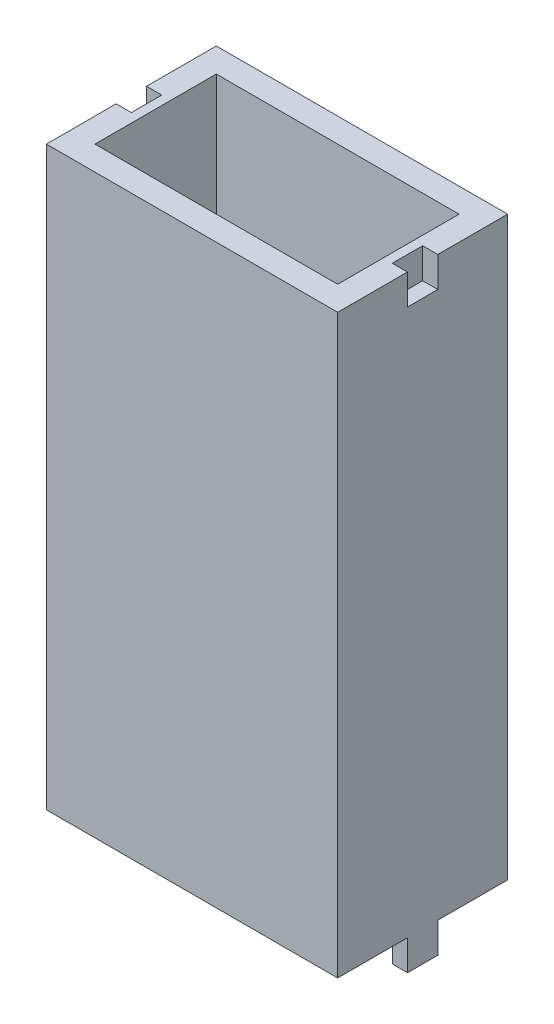
ISO-10303-21;
HEADER;
FILE_DESCRIPTION(('STEP AP214'),'2;1');
FILE_NAME('part.step','',(''),(''),'','','');
FILE_SCHEMA(('AUTOMOTIVE_DESIGN { 1 0 10303 214 1 1 1 1 }'));
ENDSEC;
DATA;
#1=APPLICATION_CONTEXT('core data for automotive mechanical design processes');
#2=APPLICATION_PROTOCOL_DEFINITION('international standard','automotive_design',2000,#1);
#3=PRODUCT_CONTEXT('',#1,'mechanical');
#4=PRODUCT('Part','Part','',(#3));
#5=PRODUCT_RELATED_PRODUCT_CATEGORY('part','',(#4));
#6=PRODUCT_DEFINITION_FORMATION('','',#4);
#7=PRODUCT_DEFINITION_CONTEXT('part definition',#1,'design');
#8=PRODUCT_DEFINITION('design','',#6,#7);
#9=PRODUCT_DEFINITION_SHAPE('','',#8);
#10=(LENGTH_UNIT() NAMED_UNIT(*) SI_UNIT(.MILLI.,.METRE.));
#11=(NAMED_UNIT(*) PLANE_ANGLE_UNIT() SI_UNIT($,.RADIAN.));
#12=(NAMED_UNIT(*) SI_UNIT($,.STERADIAN.) SOLID_ANGLE_UNIT());
#13=UNCERTAINTY_MEASURE_WITH_UNIT(LENGTH_MEASURE(1.E-05),#10,'distance_accuracy_value','');
#14=(GEOMETRIC_REPRESENTATION_CONTEXT(3) GLOBAL_UNCERTAINTY_ASSIGNED_CONTEXT((#13)) GLOBAL_UNIT_ASSIGNED_CONTEXT((#10,
#11,#12)) REPRESENTATION_CONTEXT('',''));
#15=CARTESIAN_POINT('',(0.,0.,0.));
#16=DIRECTION('',(0.,0.,1.));
#17=DIRECTION('',(1.,0.,0.));
#18=AXIS2_PLACEMENT_3D('',#15,#16,#17);
#19=CARTESIAN_POINT('',(0.,0.,0.));
#20=DIRECTION('',(0.,1.,0.));
#21=DIRECTION('',(0.,0.,1.));
#22=AXIS2_PLACEMENT_3D('',#19,#20,#21);
#23=PLANE('',#22);
#24=DIRECTION('',(0.,0.,1.));
#25=VECTOR('',#24,1.);
#26=CARTESIAN_POINT('',(0.,0.,0.));
#27=LINE('',#26,#25);
#28=CARTESIAN_POINT('',(0.,0.,0.));
#29=VERTEX_POINT('',#28);
#30=CARTESIAN_POINT('',(0.,0.,20.));
#31=VERTEX_POINT('',#30);
#32=EDGE_CURVE('E320',#29,#31,#27,.T.);
#33=ORIENTED_EDGE('',*,*,#32,.T.);
#34=DIRECTION('',(1.,0.,0.));
#35=VECTOR('',#34,1.);
#36=CARTESIAN_POINT('',(0.,0.,20.));
#37=LINE('',#36,#35);
#38=CARTESIAN_POINT('',(40.,0.,20.));
#39=VERTEX_POINT('',#38);
#40=EDGE_CURVE('E383',#31,#39,#37,.T.);
#41=ORIENTED_EDGE('',*,*,#40,.T.);
#42=DIRECTION('',(0.,0.,-1.));
#43=VECTOR('',#42,1.);
#44=CARTESIAN_POINT('',(40.,0.,0.));
#45=LINE('',#44,#43);
#46=CARTESIAN_POINT('',(40.,0.,0.));
#47=VERTEX_POINT('',#46);
#48=EDGE_CURVE('E387',#39,#47,#45,.T.);
#49=ORIENTED_EDGE('',*,*,#48,.T.);
#50=DIRECTION('',(-1.,0.,0.));
#51=VECTOR('',#50,1.);
#52=CARTESIAN_POINT('',(0.,0.,0.));
#53=LINE('',#52,#51);
#54=EDGE_CURVE('E369',#47,#29,#53,.T.);
#55=ORIENTED_EDGE('',*,*,#54,.T.);
#56=EDGE_LOOP('',(#33,#41,#49,#55));
#57=FACE_BOUND('',#56,.T.);
#58=DIRECTION('',(1.,0.,0.));
#59=VECTOR('',#58,1.);
#60=CARTESIAN_POINT('',(41.5,0.,7.50000000000001));
#61=LINE('',#60,#59);
#62=CARTESIAN_POINT('',(41.5,0.,7.50000000000001));
#63=VERTEX_POINT('',#62);
#64=CARTESIAN_POINT('',(44.,0.,7.5));
#65=VERTEX_POINT('',#64);
#66=EDGE_CURVE('E220',#63,#65,#61,.T.);
#67=ORIENTED_EDGE('',*,*,#66,.F.);
#68=DIRECTION('',(0.,0.,-1.));
#69=VECTOR('',#68,1.);
#70=CARTESIAN_POINT('',(41.5,0.,12.5));
#71=LINE('',#70,#69);
#72=CARTESIAN_POINT('',(41.5,0.,12.5));
#73=VERTEX_POINT('',#72);
#74=EDGE_CURVE('E227',#73,#63,#71,.T.);
#75=ORIENTED_EDGE('',*,*,#74,.F.);
#76=DIRECTION('',(-1.,0.,0.));
#77=VECTOR('',#76,1.);
#78=CARTESIAN_POINT('',(41.5,0.,12.5));
#79=LINE('',#78,#77);
#80=CARTESIAN_POINT('',(44.,0.,12.5));
#81=VERTEX_POINT('',#80);
#82=EDGE_CURVE('E208',#81,#73,#79,.T.);
#83=ORIENTED_EDGE('',*,*,#82,.F.);
#84=DIRECTION('',(0.,0.,-1.));
#85=VECTOR('',#84,1.);
#86=CARTESIAN_POINT('',(44.,0.,-4.));
#87=LINE('',#86,#85);
#88=CARTESIAN_POINT('',(44.,0.,24.));
#89=VERTEX_POINT('',#88);
#90=EDGE_CURVE('E433',#89,#81,#87,.T.);
#91=ORIENTED_EDGE('',*,*,#90,.F.);
#92=DIRECTION('',(1.,0.,0.));
#93=VECTOR('',#92,1.);
#94=CARTESIAN_POINT('',(-4.,0.,24.));
#95=LINE('',#94,#93);
#96=CARTESIAN_POINT('',(-4.,0.,24.));
#97=VERTEX_POINT('',#96);
#98=EDGE_CURVE('E429',#97,#89,#95,.T.);
#99=ORIENTED_EDGE('',*,*,#98,.F.);
#100=DIRECTION('',(0.,0.,1.));
#101=VECTOR('',#100,1.);
#102=CARTESIAN_POINT('',(-4.,0.,-4.));
#103=LINE('',#102,#101);
#104=CARTESIAN_POINT('',(-4.,0.,12.5));
#105=VERTEX_POINT('',#104);
#106=EDGE_CURVE('E407',#105,#97,#103,.T.);
#107=ORIENTED_EDGE('',*,*,#106,.F.);
#108=DIRECTION('',(-1.,0.,0.));
#109=VECTOR('',#108,1.);
#110=CARTESIAN_POINT('',(-4.,0.,12.5));
#111=LINE('',#110,#109);
#112=CARTESIAN_POINT('',(-1.5,0.,12.5));
#113=VERTEX_POINT('',#112);
#114=EDGE_CURVE('E69',#113,#105,#111,.T.);
#115=ORIENTED_EDGE('',*,*,#114,.F.);
#116=DIRECTION('',(0.,0.,1.));
#117=VECTOR('',#116,1.);
#118=CARTESIAN_POINT('',(-1.5,0.,12.5));
#119=LINE('',#118,#117);
#120=CARTESIAN_POINT('',(-1.5,0.,7.5));
#121=VERTEX_POINT('',#120);
#122=EDGE_CURVE('E240',#121,#113,#119,.T.);
#123=ORIENTED_EDGE('',*,*,#122,.F.);
#124=DIRECTION('',(1.,0.,0.));
#125=VECTOR('',#124,1.);
#126=CARTESIAN_POINT('',(-4.,0.,7.5));
#127=LINE('',#126,#125);
#128=CARTESIAN_POINT('',(-4.,0.,7.5));
#129=VERTEX_POINT('',#128);
#130=EDGE_CURVE('E235',#129,#121,#127,.T.);
#131=ORIENTED_EDGE('',*,*,#130,.F.);
#132=CARTESIAN_POINT('',(-4.,0.,-4.));
#133=VERTEX_POINT('',#132);
#134=EDGE_CURVE('E425',#133,#129,#103,.T.);
#135=ORIENTED_EDGE('',*,*,#134,.F.);
#136=DIRECTION('',(-1.,0.,0.));
#137=VECTOR('',#136,1.);
#138=CARTESIAN_POINT('',(-4.,0.,-4.));
#139=LINE('',#138,#137);
#140=CARTESIAN_POINT('',(44.,0.,-4.));
#141=VERTEX_POINT('',#140);
#142=EDGE_CURVE('E436',#141,#133,#139,.T.);
#143=ORIENTED_EDGE('',*,*,#142,.F.);
#144=EDGE_CURVE('E432',#65,#141,#87,.T.);
#145=ORIENTED_EDGE('',*,*,#144,.F.);
#146=EDGE_LOOP('',(#67,#75,#83,#91,#99,#107,#115,#123,#131,#135,#143,#145));
#147=FACE_BOUND('',#146,.T.);
#148=ADVANCED_FACE('F45',(#57,#147),#23,.F.);
#149=CARTESIAN_POINT('',(0.,95.,0.));
#150=DIRECTION('',(0.,1.,0.));
#151=DIRECTION('',(0.,0.,1.));
#152=AXIS2_PLACEMENT_3D('',#149,#150,#151);
#153=PLANE('',#152);
#154=DIRECTION('',(-1.,0.,0.));
#155=VECTOR('',#154,1.);
#156=CARTESIAN_POINT('',(-4.,95.,7.5));
#157=LINE('',#156,#155);
#158=CARTESIAN_POINT('',(-1.5,95.,7.5));
#159=VERTEX_POINT('',#158);
#160=CARTESIAN_POINT('',(-4.,95.,7.5));
#161=VERTEX_POINT('',#160);
#162=EDGE_CURVE('E293',#159,#161,#157,.T.);
#163=ORIENTED_EDGE('',*,*,#162,.F.);
#164=DIRECTION('',(0.,0.,-1.));
#165=VECTOR('',#164,1.);
#166=CARTESIAN_POINT('',(-1.5,95.,7.5));
#167=LINE('',#166,#165);
#168=CARTESIAN_POINT('',(-1.5,95.,12.5));
#169=VERTEX_POINT('',#168);
#170=EDGE_CURVE('E309',#169,#159,#167,.T.);
#171=ORIENTED_EDGE('',*,*,#170,.F.);
#172=DIRECTION('',(1.,0.,0.));
#173=VECTOR('',#172,1.);
#174=CARTESIAN_POINT('',(-4.,95.,12.5));
#175=LINE('',#174,#173);
#176=CARTESIAN_POINT('',(-4.,95.,12.5));
#177=VERTEX_POINT('',#176);
#178=EDGE_CURVE('E305',#177,#169,#175,.T.);
#179=ORIENTED_EDGE('',*,*,#178,.F.);
#180=DIRECTION('',(0.,0.,1.));
#181=VECTOR('',#180,1.);
#182=CARTESIAN_POINT('',(-4.,95.,-4.));
#183=LINE('',#182,#181);
#184=CARTESIAN_POINT('',(-4.,95.,24.));
#185=VERTEX_POINT('',#184);
#186=EDGE_CURVE('E413',#177,#185,#183,.T.);
#187=ORIENTED_EDGE('',*,*,#186,.T.);
#188=DIRECTION('',(1.,0.,0.));
#189=VECTOR('',#188,1.);
#190=CARTESIAN_POINT('',(-4.,95.,24.));
#191=LINE('',#190,#189);
#192=CARTESIAN_POINT('',(44.,95.,24.));
#193=VERTEX_POINT('',#192);
#194=EDGE_CURVE('E412',#185,#193,#191,.T.);
#195=ORIENTED_EDGE('',*,*,#194,.T.);
#196=DIRECTION('',(0.,0.,-1.));
#197=VECTOR('',#196,1.);
#198=CARTESIAN_POINT('',(44.,95.,-4.));
#199=LINE('',#198,#197);
#200=CARTESIAN_POINT('',(44.,95.,12.5));
#201=VERTEX_POINT('',#200);
#202=EDGE_CURVE('E417',#193,#201,#199,.T.);
#203=ORIENTED_EDGE('',*,*,#202,.T.);
#204=DIRECTION('',(1.,0.,0.));
#205=VECTOR('',#204,1.);
#206=CARTESIAN_POINT('',(41.5,95.,12.5));
#207=LINE('',#206,#205);
#208=CARTESIAN_POINT('',(41.5,95.,12.5));
#209=VERTEX_POINT('',#208);
#210=EDGE_CURVE('E346',#209,#201,#207,.T.);
#211=ORIENTED_EDGE('',*,*,#210,.F.);
#212=DIRECTION('',(0.,0.,1.));
#213=VECTOR('',#212,1.);
#214=CARTESIAN_POINT('',(41.5,95.,7.5));
#215=LINE('',#214,#213);
#216=CARTESIAN_POINT('',(41.5,95.,7.5));
#217=VERTEX_POINT('',#216);
#218=EDGE_CURVE('E310',#217,#209,#215,.T.);
#219=ORIENTED_EDGE('',*,*,#218,.F.);
#220=DIRECTION('',(-1.,0.,0.));
#221=VECTOR('',#220,1.);
#222=CARTESIAN_POINT('',(41.5,95.,7.5));
#223=LINE('',#222,#221);
#224=CARTESIAN_POINT('',(44.,95.,7.5));
#225=VERTEX_POINT('',#224);
#226=EDGE_CURVE('E342',#225,#217,#223,.T.);
#227=ORIENTED_EDGE('',*,*,#226,.F.);
#228=CARTESIAN_POINT('',(44.,95.,-4.));
#229=VERTEX_POINT('',#228);
#230=EDGE_CURVE('E416',#225,#229,#199,.T.);
#231=ORIENTED_EDGE('',*,*,#230,.T.);
#232=DIRECTION('',(-1.,0.,0.));
#233=VECTOR('',#232,1.);
#234=CARTESIAN_POINT('',(-4.,95.,-4.));
#235=LINE('',#234,#233);
#236=CARTESIAN_POINT('',(-4.,95.,-4.));
#237=VERTEX_POINT('',#236);
#238=EDGE_CURVE('E421',#229,#237,#235,.T.);
#239=ORIENTED_EDGE('',*,*,#238,.T.);
#240=EDGE_CURVE('E408',#237,#161,#183,.T.);
#241=ORIENTED_EDGE('',*,*,#240,.T.);
#242=EDGE_LOOP('',(#163,#171,#179,#187,#195,#203,#211,#219,#227,#231,#239,#241));
#243=FACE_BOUND('',#242,.T.);
#244=DIRECTION('',(1.,0.,0.));
#245=VECTOR('',#244,1.);
#246=CARTESIAN_POINT('',(0.,95.,20.));
#247=LINE('',#246,#245);
#248=CARTESIAN_POINT('',(0.,95.,20.));
#249=VERTEX_POINT('',#248);
#250=CARTESIAN_POINT('',(40.,95.,20.));
#251=VERTEX_POINT('',#250);
#252=EDGE_CURVE('E368',#249,#251,#247,.T.);
#253=ORIENTED_EDGE('',*,*,#252,.F.);
#254=DIRECTION('',(0.,0.,1.));
#255=VECTOR('',#254,1.);
#256=CARTESIAN_POINT('',(0.,95.,0.));
#257=LINE('',#256,#255);
#258=CARTESIAN_POINT('',(0.,95.,0.));
#259=VERTEX_POINT('',#258);
#260=EDGE_CURVE('E365',#259,#249,#257,.T.);
#261=ORIENTED_EDGE('',*,*,#260,.F.);
#262=DIRECTION('',(-1.,0.,0.));
#263=VECTOR('',#262,1.);
#264=CARTESIAN_POINT('',(0.,95.,0.));
#265=LINE('',#264,#263);
#266=CARTESIAN_POINT('',(40.,95.,0.));
#267=VERTEX_POINT('',#266);
#268=EDGE_CURVE('E376',#267,#259,#265,.T.);
#269=ORIENTED_EDGE('',*,*,#268,.F.);
#270=DIRECTION('',(0.,0.,-1.));
#271=VECTOR('',#270,1.);
#272=CARTESIAN_POINT('',(40.,95.,0.));
#273=LINE('',#272,#271);
#274=EDGE_CURVE('E372',#251,#267,#273,.T.);
#275=ORIENTED_EDGE('',*,*,#274,.F.);
#276=EDGE_LOOP('',(#253,#261,#269,#275));
#277=FACE_BOUND('',#276,.T.);
#278=ADVANCED_FACE('F470',(#243,#277),#153,.T.);
#279=CARTESIAN_POINT('',(-4.,95.,-4.));
#280=DIRECTION('',(1.,0.,0.));
#281=DIRECTION('',(0.,0.,-1.));
#282=AXIS2_PLACEMENT_3D('',#279,#280,#281);
#283=PLANE('',#282);
#284=DIRECTION('',(0.,0.,1.));
#285=VECTOR('',#284,1.);
#286=CARTESIAN_POINT('',(-4.,90.,7.5));
#287=LINE('',#286,#285);
#288=CARTESIAN_POINT('',(-4.,90.,7.5));
#289=VERTEX_POINT('',#288);
#290=CARTESIAN_POINT('',(-4.,90.,12.5));
#291=VERTEX_POINT('',#290);
#292=EDGE_CURVE('E288',#289,#291,#287,.T.);
#293=ORIENTED_EDGE('',*,*,#292,.F.);
#294=DIRECTION('',(0.,1.,0.));
#295=VECTOR('',#294,1.);
#296=CARTESIAN_POINT('',(-4.,90.,7.5));
#297=LINE('',#296,#295);
#298=EDGE_CURVE('E316',#289,#161,#297,.T.);
#299=ORIENTED_EDGE('',*,*,#298,.T.);
#300=ORIENTED_EDGE('',*,*,#240,.F.);
#301=DIRECTION('',(0.,-1.,0.));
#302=VECTOR('',#301,1.);
#303=CARTESIAN_POINT('',(-4.,95.,-4.));
#304=LINE('',#303,#302);
#305=EDGE_CURVE('E424',#237,#133,#304,.T.);
#306=ORIENTED_EDGE('',*,*,#305,.T.);
#307=ORIENTED_EDGE('',*,*,#134,.T.);
#308=DIRECTION('',(0.,1.,0.));
#309=VECTOR('',#308,1.);
#310=CARTESIAN_POINT('',(-4.,-5.,7.5));
#311=LINE('',#310,#309);
#312=CARTESIAN_POINT('',(-4.,-5.,7.5));
#313=VERTEX_POINT('',#312);
#314=EDGE_CURVE('E283',#313,#129,#311,.T.);
#315=ORIENTED_EDGE('',*,*,#314,.F.);
#316=DIRECTION('',(0.,0.,-1.));
#317=VECTOR('',#316,1.);
#318=CARTESIAN_POINT('',(-4.,-5.,12.5));
#319=LINE('',#318,#317);
#320=CARTESIAN_POINT('',(-4.,-5.,12.5));
#321=VERTEX_POINT('',#320);
#322=EDGE_CURVE('E254',#321,#313,#319,.T.);
#323=ORIENTED_EDGE('',*,*,#322,.F.);
#324=DIRECTION('',(0.,1.,0.));
#325=VECTOR('',#324,1.);
#326=CARTESIAN_POINT('',(-4.,-5.,12.5));
#327=LINE('',#326,#325);
#328=EDGE_CURVE('E266',#321,#105,#327,.T.);
#329=ORIENTED_EDGE('',*,*,#328,.T.);
#330=ORIENTED_EDGE('',*,*,#106,.T.);
#331=DIRECTION('',(0.,-1.,0.));
#332=VECTOR('',#331,1.);
#333=CARTESIAN_POINT('',(-4.,95.,24.));
#334=LINE('',#333,#332);
#335=EDGE_CURVE('E11',#185,#97,#334,.T.);
#336=ORIENTED_EDGE('',*,*,#335,.F.);
#337=ORIENTED_EDGE('',*,*,#186,.F.);
#338=DIRECTION('',(0.,1.,0.));
#339=VECTOR('',#338,1.);
#340=CARTESIAN_POINT('',(-4.,90.,12.5));
#341=LINE('',#340,#339);
#342=EDGE_CURVE('E304',#291,#177,#341,.T.);
#343=ORIENTED_EDGE('',*,*,#342,.F.);
#344=EDGE_LOOP('',(#293,#299,#300,#306,#307,#315,#323,#329,#330,#336,#337,#343));
#345=FACE_BOUND('',#344,.T.);
#346=ADVANCED_FACE('F47',(#345),#283,.F.);
#347=CARTESIAN_POINT('',(-4.,95.,24.));
#348=DIRECTION('',(0.,0.,-1.));
#349=DIRECTION('',(-1.,0.,0.));
#350=AXIS2_PLACEMENT_3D('',#347,#348,#349);
#351=PLANE('',#350);
#352=ORIENTED_EDGE('',*,*,#98,.T.);
#353=DIRECTION('',(0.,-1.,0.));
#354=VECTOR('',#353,1.);
#355=CARTESIAN_POINT('',(44.,95.,24.));
#356=LINE('',#355,#354);
#357=EDGE_CURVE('E54',#193,#89,#356,.T.);
#358=ORIENTED_EDGE('',*,*,#357,.F.);
#359=ORIENTED_EDGE('',*,*,#194,.F.);
#360=ORIENTED_EDGE('',*,*,#335,.T.);
#361=EDGE_LOOP('',(#352,#358,#359,#360));
#362=FACE_BOUND('',#361,.T.);
#363=ADVANCED_FACE('F455',(#362),#351,.F.);
#364=CARTESIAN_POINT('',(44.,95.,-4.));
#365=DIRECTION('',(-1.,0.,0.));
#366=DIRECTION('',(0.,0.,1.));
#367=AXIS2_PLACEMENT_3D('',#364,#365,#366);
#368=PLANE('',#367);
#369=ORIENTED_EDGE('',*,*,#230,.F.);
#370=DIRECTION('',(0.,1.,0.));
#371=VECTOR('',#370,1.);
#372=CARTESIAN_POINT('',(44.,90.,7.5));
#373=LINE('',#372,#371);
#374=CARTESIAN_POINT('',(44.,90.,7.5));
#375=VERTEX_POINT('',#374);
#376=EDGE_CURVE('E337',#375,#225,#373,.T.);
#377=ORIENTED_EDGE('',*,*,#376,.F.);
#378=DIRECTION('',(0.,0.,-1.));
#379=VECTOR('',#378,1.);
#380=CARTESIAN_POINT('',(44.,90.,7.5));
#381=LINE('',#380,#379);
#382=CARTESIAN_POINT('',(44.,90.,12.5));
#383=VERTEX_POINT('',#382);
#384=EDGE_CURVE('E356',#383,#375,#381,.T.);
#385=ORIENTED_EDGE('',*,*,#384,.F.);
#386=DIRECTION('',(0.,1.,0.));
#387=VECTOR('',#386,1.);
#388=CARTESIAN_POINT('',(44.,90.,12.5));
#389=LINE('',#388,#387);
#390=EDGE_CURVE('E333',#383,#201,#389,.T.);
#391=ORIENTED_EDGE('',*,*,#390,.T.);
#392=ORIENTED_EDGE('',*,*,#202,.F.);
#393=ORIENTED_EDGE('',*,*,#357,.T.);
#394=ORIENTED_EDGE('',*,*,#90,.T.);
#395=DIRECTION('',(0.,1.,0.));
#396=VECTOR('',#395,1.);
#397=CARTESIAN_POINT('',(44.,-5.,12.5));
#398=LINE('',#397,#396);
#399=CARTESIAN_POINT('',(44.,-5.,12.5));
#400=VERTEX_POINT('',#399);
#401=EDGE_CURVE('E215',#400,#81,#398,.T.);
#402=ORIENTED_EDGE('',*,*,#401,.F.);
#403=DIRECTION('',(0.,0.,1.));
#404=VECTOR('',#403,1.);
#405=CARTESIAN_POINT('',(44.,-5.,12.5));
#406=LINE('',#405,#404);
#407=CARTESIAN_POINT('',(44.,-5.,7.5));
#408=VERTEX_POINT('',#407);
#409=EDGE_CURVE('E246',#408,#400,#406,.T.);
#410=ORIENTED_EDGE('',*,*,#409,.F.);
#411=DIRECTION('',(0.,1.,0.));
#412=VECTOR('',#411,1.);
#413=CARTESIAN_POINT('',(44.,-5.,7.5));
#414=LINE('',#413,#412);
#415=EDGE_CURVE('E61',#408,#65,#414,.T.);
#416=ORIENTED_EDGE('',*,*,#415,.T.);
#417=ORIENTED_EDGE('',*,*,#144,.T.);
#418=DIRECTION('',(0.,-1.,0.));
#419=VECTOR('',#418,1.);
#420=CARTESIAN_POINT('',(44.,95.,-4.));
#421=LINE('',#420,#419);
#422=EDGE_CURVE('E442',#229,#141,#421,.T.);
#423=ORIENTED_EDGE('',*,*,#422,.F.);
#424=EDGE_LOOP('',(#369,#377,#385,#391,#392,#393,#394,#402,#410,#416,#417,#423));
#425=FACE_BOUND('',#424,.T.);
#426=ADVANCED_FACE('F450',(#425),#368,.F.);
#427=CARTESIAN_POINT('',(-4.,95.,-4.));
#428=DIRECTION('',(0.,0.,1.));
#429=DIRECTION('',(1.,0.,0.));
#430=AXIS2_PLACEMENT_3D('',#427,#428,#429);
#431=PLANE('',#430);
#432=ORIENTED_EDGE('',*,*,#142,.T.);
#433=ORIENTED_EDGE('',*,*,#305,.F.);
#434=ORIENTED_EDGE('',*,*,#238,.F.);
#435=ORIENTED_EDGE('',*,*,#422,.T.);
#436=EDGE_LOOP('',(#432,#433,#434,#435));
#437=FACE_BOUND('',#436,.T.);
#438=ADVANCED_FACE('F478',(#437),#431,.F.);
#439=CARTESIAN_POINT('',(0.,95.,0.));
#440=DIRECTION('',(1.,0.,0.));
#441=DIRECTION('',(0.,0.,-1.));
#442=AXIS2_PLACEMENT_3D('',#439,#440,#441);
#443=PLANE('',#442);
#444=ORIENTED_EDGE('',*,*,#32,.F.);
#445=DIRECTION('',(0.,-1.,0.));
#446=VECTOR('',#445,1.);
#447=CARTESIAN_POINT('',(0.,95.,0.));
#448=LINE('',#447,#446);
#449=EDGE_CURVE('E379',#259,#29,#448,.T.);
#450=ORIENTED_EDGE('',*,*,#449,.F.);
#451=ORIENTED_EDGE('',*,*,#260,.T.);
#452=DIRECTION('',(0.,-1.,0.));
#453=VECTOR('',#452,1.);
#454=CARTESIAN_POINT('',(0.,95.,20.));
#455=LINE('',#454,#453);
#456=EDGE_CURVE('E403',#249,#31,#455,.T.);
#457=ORIENTED_EDGE('',*,*,#456,.T.);
#458=EDGE_LOOP('',(#444,#450,#451,#457));
#459=FACE_BOUND('',#458,.T.);
#460=ADVANCED_FACE('F532',(#459),#443,.T.);
#461=CARTESIAN_POINT('',(0.,95.,20.));
#462=DIRECTION('',(0.,0.,-1.));
#463=DIRECTION('',(-1.,0.,0.));
#464=AXIS2_PLACEMENT_3D('',#461,#462,#463);
#465=PLANE('',#464);
#466=ORIENTED_EDGE('',*,*,#40,.F.);
#467=ORIENTED_EDGE('',*,*,#456,.F.);
#468=ORIENTED_EDGE('',*,*,#252,.T.);
#469=DIRECTION('',(0.,-1.,0.));
#470=VECTOR('',#469,1.);
#471=CARTESIAN_POINT('',(40.,95.,20.));
#472=LINE('',#471,#470);
#473=EDGE_CURVE('E400',#251,#39,#472,.T.);
#474=ORIENTED_EDGE('',*,*,#473,.T.);
#475=EDGE_LOOP('',(#466,#467,#468,#474));
#476=FACE_BOUND('',#475,.T.);
#477=ADVANCED_FACE('F687',(#476),#465,.T.);
#478=CARTESIAN_POINT('',(40.,95.,0.));
#479=DIRECTION('',(-1.,0.,0.));
#480=DIRECTION('',(0.,0.,1.));
#481=AXIS2_PLACEMENT_3D('',#478,#479,#480);
#482=PLANE('',#481);
#483=ORIENTED_EDGE('',*,*,#48,.F.);
#484=ORIENTED_EDGE('',*,*,#473,.F.);
#485=ORIENTED_EDGE('',*,*,#274,.T.);
#486=DIRECTION('',(0.,-1.,0.));
#487=VECTOR('',#486,1.);
#488=CARTESIAN_POINT('',(40.,95.,0.));
#489=LINE('',#488,#487);
#490=EDGE_CURVE('E397',#267,#47,#489,.T.);
#491=ORIENTED_EDGE('',*,*,#490,.T.);
#492=EDGE_LOOP('',(#483,#484,#485,#491));
#493=FACE_BOUND('',#492,.T.);
#494=ADVANCED_FACE('F515',(#493),#482,.T.);
#495=CARTESIAN_POINT('',(0.,95.,0.));
#496=DIRECTION('',(0.,0.,1.));
#497=DIRECTION('',(1.,0.,0.));
#498=AXIS2_PLACEMENT_3D('',#495,#496,#497);
#499=PLANE('',#498);
#500=ORIENTED_EDGE('',*,*,#54,.F.);
#501=ORIENTED_EDGE('',*,*,#490,.F.);
#502=ORIENTED_EDGE('',*,*,#268,.T.);
#503=ORIENTED_EDGE('',*,*,#449,.T.);
#504=EDGE_LOOP('',(#500,#501,#502,#503));
#505=FACE_BOUND('',#504,.T.);
#506=ADVANCED_FACE('F507',(#505),#499,.T.);
#507=CARTESIAN_POINT('',(41.5,90.,7.5));
#508=DIRECTION('',(-1.,0.,0.));
#509=DIRECTION('',(0.,0.,1.));
#510=AXIS2_PLACEMENT_3D('',#507,#508,#509);
#511=PLANE('',#510);
#512=ORIENTED_EDGE('',*,*,#218,.T.);
#513=DIRECTION('',(0.,1.,0.));
#514=VECTOR('',#513,1.);
#515=CARTESIAN_POINT('',(41.5,90.,12.5));
#516=LINE('',#515,#514);
#517=CARTESIAN_POINT('',(41.5,90.,12.5));
#518=VERTEX_POINT('',#517);
#519=EDGE_CURVE('E329',#518,#209,#516,.T.);
#520=ORIENTED_EDGE('',*,*,#519,.F.);
#521=DIRECTION('',(0.,0.,1.));
#522=VECTOR('',#521,1.);
#523=CARTESIAN_POINT('',(41.5,90.,7.5));
#524=LINE('',#523,#522);
#525=CARTESIAN_POINT('',(41.5,90.,7.5));
#526=VERTEX_POINT('',#525);
#527=EDGE_CURVE('E347',#526,#518,#524,.T.);
#528=ORIENTED_EDGE('',*,*,#527,.F.);
#529=DIRECTION('',(0.,1.,0.));
#530=VECTOR('',#529,1.);
#531=CARTESIAN_POINT('',(41.5,90.,7.5));
#532=LINE('',#531,#530);
#533=EDGE_CURVE('E287',#526,#217,#532,.T.);
#534=ORIENTED_EDGE('',*,*,#533,.T.);
#535=EDGE_LOOP('',(#512,#520,#528,#534));
#536=FACE_BOUND('',#535,.T.);
#537=ADVANCED_FACE('F505',(#536),#511,.F.);
#538=CARTESIAN_POINT('',(41.5,90.,7.5));
#539=DIRECTION('',(0.,0.,-1.));
#540=DIRECTION('',(-1.,0.,0.));
#541=AXIS2_PLACEMENT_3D('',#538,#539,#540);
#542=PLANE('',#541);
#543=ORIENTED_EDGE('',*,*,#226,.T.);
#544=ORIENTED_EDGE('',*,*,#533,.F.);
#545=DIRECTION('',(-1.,0.,0.));
#546=VECTOR('',#545,1.);
#547=CARTESIAN_POINT('',(41.5,90.,7.5));
#548=LINE('',#547,#546);
#549=EDGE_CURVE('E332',#375,#526,#548,.T.);
#550=ORIENTED_EDGE('',*,*,#549,.F.);
#551=ORIENTED_EDGE('',*,*,#376,.T.);
#552=EDGE_LOOP('',(#543,#544,#550,#551));
#553=FACE_BOUND('',#552,.T.);
#554=ADVANCED_FACE('F502',(#553),#542,.F.);
#555=CARTESIAN_POINT('',(41.5,90.,12.5));
#556=DIRECTION('',(0.,0.,1.));
#557=DIRECTION('',(1.,0.,0.));
#558=AXIS2_PLACEMENT_3D('',#555,#556,#557);
#559=PLANE('',#558);
#560=ORIENTED_EDGE('',*,*,#210,.T.);
#561=ORIENTED_EDGE('',*,*,#390,.F.);
#562=DIRECTION('',(1.,0.,0.));
#563=VECTOR('',#562,1.);
#564=CARTESIAN_POINT('',(41.5,90.,12.5));
#565=LINE('',#564,#563);
#566=EDGE_CURVE('E359',#518,#383,#565,.T.);
#567=ORIENTED_EDGE('',*,*,#566,.F.);
#568=ORIENTED_EDGE('',*,*,#519,.T.);
#569=EDGE_LOOP('',(#560,#561,#567,#568));
#570=FACE_BOUND('',#569,.T.);
#571=ADVANCED_FACE('F495',(#570),#559,.F.);
#572=CARTESIAN_POINT('',(0.,90.,0.));
#573=DIRECTION('',(0.,1.,0.));
#574=DIRECTION('',(0.,0.,1.));
#575=AXIS2_PLACEMENT_3D('',#572,#573,#574);
#576=PLANE('',#575);
#577=ORIENTED_EDGE('',*,*,#527,.T.);
#578=ORIENTED_EDGE('',*,*,#566,.T.);
#579=ORIENTED_EDGE('',*,*,#384,.T.);
#580=ORIENTED_EDGE('',*,*,#549,.T.);
#581=EDGE_LOOP('',(#577,#578,#579,#580));
#582=FACE_BOUND('',#581,.T.);
#583=ADVANCED_FACE('F500',(#582),#576,.T.);
#584=CARTESIAN_POINT('',(-4.,90.,7.5));
#585=DIRECTION('',(0.,0.,-1.));
#586=DIRECTION('',(-1.,0.,0.));
#587=AXIS2_PLACEMENT_3D('',#584,#585,#586);
#588=PLANE('',#587);
#589=ORIENTED_EDGE('',*,*,#162,.T.);
#590=ORIENTED_EDGE('',*,*,#298,.F.);
#591=DIRECTION('',(-1.,0.,0.));
#592=VECTOR('',#591,1.);
#593=CARTESIAN_POINT('',(-4.,90.,7.5));
#594=LINE('',#593,#592);
#595=CARTESIAN_POINT('',(-1.5,90.,7.5));
#596=VERTEX_POINT('',#595);
#597=EDGE_CURVE('E301',#596,#289,#594,.T.);
#598=ORIENTED_EDGE('',*,*,#597,.F.);
#599=DIRECTION('',(0.,1.,0.));
#600=VECTOR('',#599,1.);
#601=CARTESIAN_POINT('',(-1.5,90.,7.5));
#602=LINE('',#601,#600);
#603=EDGE_CURVE('E321',#596,#159,#602,.T.);
#604=ORIENTED_EDGE('',*,*,#603,.T.);
#605=EDGE_LOOP('',(#589,#590,#598,#604));
#606=FACE_BOUND('',#605,.T.);
#607=ADVANCED_FACE('F485',(#606),#588,.F.);
#608=CARTESIAN_POINT('',(-1.5,90.,7.5));
#609=DIRECTION('',(1.,0.,0.));
#610=DIRECTION('',(0.,0.,-1.));
#611=AXIS2_PLACEMENT_3D('',#608,#609,#610);
#612=PLANE('',#611);
#613=ORIENTED_EDGE('',*,*,#170,.T.);
#614=ORIENTED_EDGE('',*,*,#603,.F.);
#615=DIRECTION('',(0.,0.,-1.));
#616=VECTOR('',#615,1.);
#617=CARTESIAN_POINT('',(-1.5,90.,7.5));
#618=LINE('',#617,#616);
#619=CARTESIAN_POINT('',(-1.5,90.,12.5));
#620=VERTEX_POINT('',#619);
#621=EDGE_CURVE('E297',#620,#596,#618,.T.);
#622=ORIENTED_EDGE('',*,*,#621,.F.);
#623=DIRECTION('',(0.,1.,0.));
#624=VECTOR('',#623,1.);
#625=CARTESIAN_POINT('',(-1.5,90.,12.5));
#626=LINE('',#625,#624);
#627=EDGE_CURVE('E324',#620,#169,#626,.T.);
#628=ORIENTED_EDGE('',*,*,#627,.T.);
#629=EDGE_LOOP('',(#613,#614,#622,#628));
#630=FACE_BOUND('',#629,.T.);
#631=ADVANCED_FACE('F489',(#630),#612,.F.);
#632=CARTESIAN_POINT('',(-4.,90.,12.5));
#633=DIRECTION('',(0.,0.,1.));
#634=DIRECTION('',(1.,0.,0.));
#635=AXIS2_PLACEMENT_3D('',#632,#633,#634);
#636=PLANE('',#635);
#637=ORIENTED_EDGE('',*,*,#178,.T.);
#638=ORIENTED_EDGE('',*,*,#627,.F.);
#639=DIRECTION('',(1.,0.,0.));
#640=VECTOR('',#639,1.);
#641=CARTESIAN_POINT('',(-4.,90.,12.5));
#642=LINE('',#641,#640);
#643=EDGE_CURVE('E292',#291,#620,#642,.T.);
#644=ORIENTED_EDGE('',*,*,#643,.F.);
#645=ORIENTED_EDGE('',*,*,#342,.T.);
#646=EDGE_LOOP('',(#637,#638,#644,#645));
#647=FACE_BOUND('',#646,.T.);
#648=ADVANCED_FACE('F491',(#647),#636,.F.);
#649=CARTESIAN_POINT('',(0.,90.,0.));
#650=DIRECTION('',(0.,1.,0.));
#651=DIRECTION('',(0.,0.,1.));
#652=AXIS2_PLACEMENT_3D('',#649,#650,#651);
#653=PLANE('',#652);
#654=ORIENTED_EDGE('',*,*,#292,.T.);
#655=ORIENTED_EDGE('',*,*,#643,.T.);
#656=ORIENTED_EDGE('',*,*,#621,.T.);
#657=ORIENTED_EDGE('',*,*,#597,.T.);
#658=EDGE_LOOP('',(#654,#655,#656,#657));
#659=FACE_BOUND('',#658,.T.);
#660=ADVANCED_FACE('F553',(#659),#653,.T.);
#661=CARTESIAN_POINT('',(-4.,-5.,7.5));
#662=DIRECTION('',(0.,0.,1.));
#663=DIRECTION('',(1.,0.,0.));
#664=AXIS2_PLACEMENT_3D('',#661,#662,#663);
#665=PLANE('',#664);
#666=ORIENTED_EDGE('',*,*,#130,.T.);
#667=DIRECTION('',(0.,1.,0.));
#668=VECTOR('',#667,1.);
#669=CARTESIAN_POINT('',(-1.5,-5.,7.5));
#670=LINE('',#669,#668);
#671=CARTESIAN_POINT('',(-1.5,-5.,7.5));
#672=VERTEX_POINT('',#671);
#673=EDGE_CURVE('E279',#672,#121,#670,.T.);
#674=ORIENTED_EDGE('',*,*,#673,.F.);
#675=DIRECTION('',(1.,0.,0.));
#676=VECTOR('',#675,1.);
#677=CARTESIAN_POINT('',(-4.,-5.,7.5));
#678=LINE('',#677,#676);
#679=EDGE_CURVE('E258',#313,#672,#678,.T.);
#680=ORIENTED_EDGE('',*,*,#679,.F.);
#681=ORIENTED_EDGE('',*,*,#314,.T.);
#682=EDGE_LOOP('',(#666,#674,#680,#681));
#683=FACE_BOUND('',#682,.T.);
#684=ADVANCED_FACE('F549',(#683),#665,.F.);
#685=CARTESIAN_POINT('',(-1.5,-5.,12.5));
#686=DIRECTION('',(-1.,0.,0.));
#687=DIRECTION('',(0.,0.,1.));
#688=AXIS2_PLACEMENT_3D('',#685,#686,#687);
#689=PLANE('',#688);
#690=ORIENTED_EDGE('',*,*,#122,.T.);
#691=DIRECTION('',(0.,1.,0.));
#692=VECTOR('',#691,1.);
#693=CARTESIAN_POINT('',(-1.5,-5.,12.5));
#694=LINE('',#693,#692);
#695=CARTESIAN_POINT('',(-1.5,-5.,12.5));
#696=VERTEX_POINT('',#695);
#697=EDGE_CURVE('E275',#696,#113,#694,.T.);
#698=ORIENTED_EDGE('',*,*,#697,.F.);
#699=DIRECTION('',(0.,0.,1.));
#700=VECTOR('',#699,1.);
#701=CARTESIAN_POINT('',(-1.5,-5.,12.5));
#702=LINE('',#701,#700);
#703=EDGE_CURVE('E261',#672,#696,#702,.T.);
#704=ORIENTED_EDGE('',*,*,#703,.F.);
#705=ORIENTED_EDGE('',*,*,#673,.T.);
#706=EDGE_LOOP('',(#690,#698,#704,#705));
#707=FACE_BOUND('',#706,.T.);
#708=ADVANCED_FACE('F552',(#707),#689,.F.);
#709=CARTESIAN_POINT('',(-4.,-5.,12.5));
#710=DIRECTION('',(0.,0.,-1.));
#711=DIRECTION('',(-1.,0.,0.));
#712=AXIS2_PLACEMENT_3D('',#709,#710,#711);
#713=PLANE('',#712);
#714=ORIENTED_EDGE('',*,*,#114,.T.);
#715=ORIENTED_EDGE('',*,*,#328,.F.);
#716=DIRECTION('',(-1.,0.,0.));
#717=VECTOR('',#716,1.);
#718=CARTESIAN_POINT('',(-4.,-5.,12.5));
#719=LINE('',#718,#717);
#720=EDGE_CURVE('E264',#696,#321,#719,.T.);
#721=ORIENTED_EDGE('',*,*,#720,.F.);
#722=ORIENTED_EDGE('',*,*,#697,.T.);
#723=EDGE_LOOP('',(#714,#715,#721,#722));
#724=FACE_BOUND('',#723,.T.);
#725=ADVANCED_FACE('F562',(#724),#713,.F.);
#726=CARTESIAN_POINT('',(0.,-5.,0.));
#727=DIRECTION('',(0.,-1.,0.));
#728=DIRECTION('',(0.,0.,-1.));
#729=AXIS2_PLACEMENT_3D('',#726,#727,#728);
#730=PLANE('',#729);
#731=ORIENTED_EDGE('',*,*,#322,.T.);
#732=ORIENTED_EDGE('',*,*,#679,.T.);
#733=ORIENTED_EDGE('',*,*,#703,.T.);
#734=ORIENTED_EDGE('',*,*,#720,.T.);
#735=EDGE_LOOP('',(#731,#732,#733,#734));
#736=FACE_BOUND('',#735,.T.);
#737=ADVANCED_FACE('F571',(#736),#730,.T.);
#738=CARTESIAN_POINT('',(41.5,-5.,12.5));
#739=DIRECTION('',(1.,0.,0.));
#740=DIRECTION('',(0.,0.,-1.));
#741=AXIS2_PLACEMENT_3D('',#738,#739,#740);
#742=PLANE('',#741);
#743=ORIENTED_EDGE('',*,*,#74,.T.);
#744=DIRECTION('',(0.,1.,0.));
#745=VECTOR('',#744,1.);
#746=CARTESIAN_POINT('',(41.5,-5.,7.50000000000001));
#747=LINE('',#746,#745);
#748=CARTESIAN_POINT('',(41.5,-5.,7.50000000000001));
#749=VERTEX_POINT('',#748);
#750=EDGE_CURVE('E750',#749,#63,#747,.T.);
#751=ORIENTED_EDGE('',*,*,#750,.F.);
#752=DIRECTION('',(0.,0.,-1.));
#753=VECTOR('',#752,1.);
#754=CARTESIAN_POINT('',(41.5,-5.,12.5));
#755=LINE('',#754,#753);
#756=CARTESIAN_POINT('',(41.5,-5.,12.5));
#757=VERTEX_POINT('',#756);
#758=EDGE_CURVE('E221',#757,#749,#755,.T.);
#759=ORIENTED_EDGE('',*,*,#758,.F.);
#760=DIRECTION('',(0.,1.,0.));
#761=VECTOR('',#760,1.);
#762=CARTESIAN_POINT('',(41.5,-5.,12.5));
#763=LINE('',#762,#761);
#764=EDGE_CURVE('E212',#757,#73,#763,.T.);
#765=ORIENTED_EDGE('',*,*,#764,.T.);
#766=EDGE_LOOP('',(#743,#751,#759,#765));
#767=FACE_BOUND('',#766,.T.);
#768=ADVANCED_FACE('F225',(#767),#742,.F.);
#769=CARTESIAN_POINT('',(41.5,-5.,7.50000000000001));
#770=DIRECTION('',(0.,0.,1.));
#771=DIRECTION('',(1.,0.,0.));
#772=AXIS2_PLACEMENT_3D('',#769,#770,#771);
#773=PLANE('',#772);
#774=ORIENTED_EDGE('',*,*,#66,.T.);
#775=ORIENTED_EDGE('',*,*,#415,.F.);
#776=DIRECTION('',(1.,0.,0.));
#777=VECTOR('',#776,1.);
#778=CARTESIAN_POINT('',(41.5,-5.,7.50000000000001));
#779=LINE('',#778,#777);
#780=EDGE_CURVE('E249',#749,#408,#779,.T.);
#781=ORIENTED_EDGE('',*,*,#780,.F.);
#782=ORIENTED_EDGE('',*,*,#750,.T.);
#783=EDGE_LOOP('',(#774,#775,#781,#782));
#784=FACE_BOUND('',#783,.T.);
#785=ADVANCED_FACE('F588',(#784),#773,.F.);
#786=CARTESIAN_POINT('',(41.5,-5.,12.5));
#787=DIRECTION('',(0.,0.,-1.));
#788=DIRECTION('',(-1.,0.,0.));
#789=AXIS2_PLACEMENT_3D('',#786,#787,#788);
#790=PLANE('',#789);
#791=ORIENTED_EDGE('',*,*,#82,.T.);
#792=ORIENTED_EDGE('',*,*,#764,.F.);
#793=DIRECTION('',(-1.,0.,0.));
#794=VECTOR('',#793,1.);
#795=CARTESIAN_POINT('',(41.5,-5.,12.5));
#796=LINE('',#795,#794);
#797=EDGE_CURVE('E231',#400,#757,#796,.T.);
#798=ORIENTED_EDGE('',*,*,#797,.F.);
#799=ORIENTED_EDGE('',*,*,#401,.T.);
#800=EDGE_LOOP('',(#791,#792,#798,#799));
#801=FACE_BOUND('',#800,.T.);
#802=ADVANCED_FACE('F210',(#801),#790,.F.);
#803=CARTESIAN_POINT('',(0.,-5.,0.));
#804=DIRECTION('',(0.,-1.,0.));
#805=DIRECTION('',(0.,0.,-1.));
#806=AXIS2_PLACEMENT_3D('',#803,#804,#805);
#807=PLANE('',#806);
#808=ORIENTED_EDGE('',*,*,#758,.T.);
#809=ORIENTED_EDGE('',*,*,#780,.T.);
#810=ORIENTED_EDGE('',*,*,#409,.T.);
#811=ORIENTED_EDGE('',*,*,#797,.T.);
#812=EDGE_LOOP('',(#808,#809,#810,#811));
#813=FACE_BOUND('',#812,.T.);
#814=ADVANCED_FACE('F604',(#813),#807,.T.);
#815=CLOSED_SHELL('',(#148,#278,#346,#363,#426,#438,#460,#477,#494,#506,#537,#554,#571,#583,
#607,#631,#648,#660,#684,#708,#725,#737,#768,#785,#802,#814));
#816=MANIFOLD_SOLID_BREP('B2',#815);
#817=ADVANCED_BREP_SHAPE_REPRESENTATION('',(#18,#816),#14);
#818=SHAPE_DEFINITION_REPRESENTATION(#9,#817);
ENDSEC;
END-ISO-10303-21;
